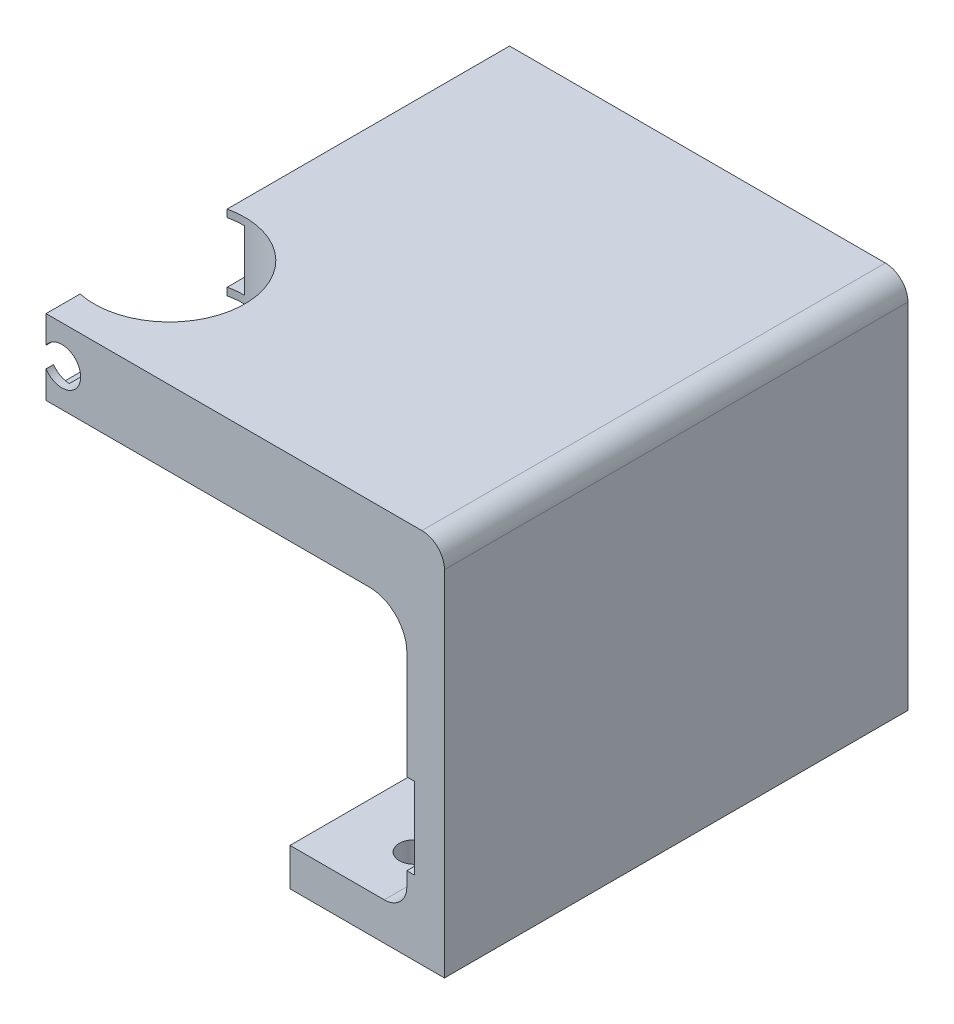
ISO-10303-21;
HEADER;
FILE_DESCRIPTION(('STEP AP214'),'2;1');
FILE_NAME('part.step','',(''),(''),'','','');
FILE_SCHEMA(('AUTOMOTIVE_DESIGN { 1 0 10303 214 1 1 1 1 }'));
ENDSEC;
DATA;
#1=APPLICATION_CONTEXT('core data for automotive mechanical design processes');
#2=APPLICATION_PROTOCOL_DEFINITION('international standard','automotive_design',2000,#1);
#3=PRODUCT_CONTEXT('',#1,'mechanical');
#4=PRODUCT('Part','Part','',(#3));
#5=PRODUCT_RELATED_PRODUCT_CATEGORY('part','',(#4));
#6=PRODUCT_DEFINITION_FORMATION('','',#4);
#7=PRODUCT_DEFINITION_CONTEXT('part definition',#1,'design');
#8=PRODUCT_DEFINITION('design','',#6,#7);
#9=PRODUCT_DEFINITION_SHAPE('','',#8);
#10=(LENGTH_UNIT() NAMED_UNIT(*) SI_UNIT(.MILLI.,.METRE.));
#11=(NAMED_UNIT(*) PLANE_ANGLE_UNIT() SI_UNIT($,.RADIAN.));
#12=(NAMED_UNIT(*) SI_UNIT($,.STERADIAN.) SOLID_ANGLE_UNIT());
#13=UNCERTAINTY_MEASURE_WITH_UNIT(LENGTH_MEASURE(1.E-05),#10,'distance_accuracy_value','');
#14=(GEOMETRIC_REPRESENTATION_CONTEXT(3) GLOBAL_UNCERTAINTY_ASSIGNED_CONTEXT((#13)) GLOBAL_UNIT_ASSIGNED_CONTEXT((#10,
#11,#12)) REPRESENTATION_CONTEXT('',''));
#15=CARTESIAN_POINT('',(0.,0.,0.));
#16=DIRECTION('',(0.,0.,1.));
#17=DIRECTION('',(1.,0.,0.));
#18=AXIS2_PLACEMENT_3D('',#15,#16,#17);
#19=CARTESIAN_POINT('',(-2.1,0.,0.));
#20=DIRECTION('',(-1.,0.,0.));
#21=DIRECTION('',(0.,0.,1.));
#22=AXIS2_PLACEMENT_3D('',#19,#20,#21);
#23=PLANE('',#22);
#24=DIRECTION('',(0.,1.,0.));
#25=VECTOR('',#24,1.);
#26=CARTESIAN_POINT('',(-2.1,-4.00000000000001,9.77701385904715));
#27=LINE('',#26,#25);
#28=CARTESIAN_POINT('',(-2.1,9.,9.77701385904715));
#29=VERTEX_POINT('',#28);
#30=CARTESIAN_POINT('',(-2.1,10.,9.77701385904715));
#31=VERTEX_POINT('',#30);
#32=EDGE_CURVE('E229',#29,#31,#27,.T.);
#33=ORIENTED_EDGE('',*,*,#32,.F.);
#34=DIRECTION('',(0.,0.,-1.));
#35=VECTOR('',#34,1.);
#36=CARTESIAN_POINT('',(-2.1,9.,-46.3));
#37=LINE('',#36,#35);
#38=CARTESIAN_POINT('',(-2.1,9.,13.3));
#39=VERTEX_POINT('',#38);
#40=EDGE_CURVE('E449',#39,#29,#37,.T.);
#41=ORIENTED_EDGE('',*,*,#40,.F.);
#42=DIRECTION('',(0.,1.,0.));
#43=VECTOR('',#42,1.);
#44=CARTESIAN_POINT('',(-2.1,9.,13.3));
#45=LINE('',#44,#43);
#46=CARTESIAN_POINT('',(-2.1,6.35646599662506,13.3));
#47=VERTEX_POINT('',#46);
#48=EDGE_CURVE('E470',#47,#39,#45,.T.);
#49=ORIENTED_EDGE('',*,*,#48,.F.);
#50=DIRECTION('',(0.,0.,1.));
#51=VECTOR('',#50,1.);
#52=CARTESIAN_POINT('',(-2.1,6.35646599662506,12.3));
#53=LINE('',#52,#51);
#54=CARTESIAN_POINT('',(-2.1,6.35646599662506,14.3));
#55=VERTEX_POINT('',#54);
#56=EDGE_CURVE('E464',#55,#47,#53,.F.);
#57=ORIENTED_EDGE('',*,*,#56,.F.);
#58=DIRECTION('',(0.,1.,0.));
#59=VECTOR('',#58,1.);
#60=CARTESIAN_POINT('',(-2.1,10.,14.3));
#61=LINE('',#60,#59);
#62=CARTESIAN_POINT('',(-2.1,10.,14.3));
#63=VERTEX_POINT('',#62);
#64=EDGE_CURVE('E258',#55,#63,#61,.T.);
#65=ORIENTED_EDGE('',*,*,#64,.T.);
#66=DIRECTION('',(0.,0.,-1.));
#67=VECTOR('',#66,1.);
#68=CARTESIAN_POINT('',(-2.1,10.,-47.3));
#69=LINE('',#68,#67);
#70=EDGE_CURVE('E253',#63,#31,#69,.T.);
#71=ORIENTED_EDGE('',*,*,#70,.T.);
#72=EDGE_LOOP('',(#33,#41,#49,#57,#65,#71));
#73=FACE_BOUND('',#72,.T.);
#74=ADVANCED_FACE('F39',(#73),#23,.T.);
#75=CARTESIAN_POINT('',(-2.1,0.,9.77701385904715));
#76=VERTEX_POINT('',#75);
#77=CARTESIAN_POINT('',(-2.1,0.999999999999999,9.77701385904715));
#78=VERTEX_POINT('',#77);
#79=EDGE_CURVE('E61',#76,#78,#27,.T.);
#80=ORIENTED_EDGE('',*,*,#79,.F.);
#81=DIRECTION('',(0.,0.,1.));
#82=VECTOR('',#81,1.);
#83=CARTESIAN_POINT('',(-2.1,0.,-47.3));
#84=LINE('',#83,#82);
#85=CARTESIAN_POINT('',(-2.1,0.,14.3));
#86=VERTEX_POINT('',#85);
#87=EDGE_CURVE('E496',#76,#86,#84,.T.);
#88=ORIENTED_EDGE('',*,*,#87,.T.);
#89=CARTESIAN_POINT('',(-2.1,3.64353400337494,14.3));
#90=VERTEX_POINT('',#89);
#91=EDGE_CURVE('E254',#86,#90,#61,.T.);
#92=ORIENTED_EDGE('',*,*,#91,.T.);
#93=DIRECTION('',(0.,0.,1.));
#94=VECTOR('',#93,1.);
#95=CARTESIAN_POINT('',(-2.1,3.64353400337494,12.3));
#96=LINE('',#95,#94);
#97=CARTESIAN_POINT('',(-2.1,3.64353400337494,13.3));
#98=VERTEX_POINT('',#97);
#99=EDGE_CURVE('E450',#98,#90,#96,.T.);
#100=ORIENTED_EDGE('',*,*,#99,.F.);
#101=CARTESIAN_POINT('',(-2.1,0.999999999999999,13.3));
#102=VERTEX_POINT('',#101);
#103=EDGE_CURVE('E471',#102,#98,#45,.T.);
#104=ORIENTED_EDGE('',*,*,#103,.F.);
#105=DIRECTION('',(0.,0.,1.));
#106=VECTOR('',#105,1.);
#107=CARTESIAN_POINT('',(-2.1,1.,-46.3));
#108=LINE('',#107,#106);
#109=EDGE_CURVE('E460',#78,#102,#108,.T.);
#110=ORIENTED_EDGE('',*,*,#109,.F.);
#111=EDGE_LOOP('',(#80,#88,#92,#100,#104,#110));
#112=FACE_BOUND('',#111,.T.);
#113=ADVANCED_FACE('F416',(#112),#23,.T.);
#114=CARTESIAN_POINT('',(-2.1,9.,-46.3));
#115=DIRECTION('',(0.,-1.,0.));
#116=DIRECTION('',(0.,0.,-1.));
#117=AXIS2_PLACEMENT_3D('',#114,#115,#116);
#118=PLANE('',#117);
#119=CARTESIAN_POINT('',(0.,9.,0.));
#120=DIRECTION('',(0.,-1.,0.));
#121=DIRECTION('',(0.,0.,-1.));
#122=AXIS2_PLACEMENT_3D('',#119,#120,#121);
#123=CIRCLE('',#122,10.);
#124=CARTESIAN_POINT('',(0.,9.,10.));
#125=VERTEX_POINT('',#124);
#126=EDGE_CURVE('E451',#125,#29,#123,.T.);
#127=ORIENTED_EDGE('',*,*,#126,.F.);
#128=DIRECTION('',(0.,0.,-1.));
#129=VECTOR('',#128,1.);
#130=CARTESIAN_POINT('',(0.,9.,-46.3));
#131=LINE('',#130,#129);
#132=CARTESIAN_POINT('',(0.,9.,13.3));
#133=VERTEX_POINT('',#132);
#134=EDGE_CURVE('E474',#133,#125,#131,.T.);
#135=ORIENTED_EDGE('',*,*,#134,.F.);
#136=DIRECTION('',(1.,0.,0.));
#137=VECTOR('',#136,1.);
#138=CARTESIAN_POINT('',(-2.1,9.,13.3));
#139=LINE('',#138,#137);
#140=EDGE_CURVE('E457',#39,#133,#139,.T.);
#141=ORIENTED_EDGE('',*,*,#140,.F.);
#142=ORIENTED_EDGE('',*,*,#40,.T.);
#143=EDGE_LOOP('',(#127,#135,#141,#142));
#144=FACE_BOUND('',#143,.T.);
#145=ADVANCED_FACE('F421',(#144),#118,.T.);
#146=CARTESIAN_POINT('',(-2.1,1.,-46.3));
#147=DIRECTION('',(0.,1.,0.));
#148=DIRECTION('',(0.,0.,1.));
#149=AXIS2_PLACEMENT_3D('',#146,#147,#148);
#150=PLANE('',#149);
#151=CARTESIAN_POINT('',(0.,0.999999999999999,0.));
#152=DIRECTION('',(0.,1.,0.));
#153=DIRECTION('',(0.,0.,1.));
#154=AXIS2_PLACEMENT_3D('',#151,#152,#153);
#155=CIRCLE('',#154,10.);
#156=CARTESIAN_POINT('',(0.,1.,-10.));
#157=VERTEX_POINT('',#156);
#158=CARTESIAN_POINT('',(-2.1,0.999999999999999,-9.77701385904715));
#159=VERTEX_POINT('',#158);
#160=EDGE_CURVE('E11',#157,#159,#155,.T.);
#161=ORIENTED_EDGE('',*,*,#160,.F.);
#162=DIRECTION('',(0.,0.,1.));
#163=VECTOR('',#162,1.);
#164=CARTESIAN_POINT('',(0.,1.,-46.3));
#165=LINE('',#164,#163);
#166=CARTESIAN_POINT('',(0.,1.,-46.3));
#167=VERTEX_POINT('',#166);
#168=EDGE_CURVE('E481',#167,#157,#165,.T.);
#169=ORIENTED_EDGE('',*,*,#168,.F.);
#170=DIRECTION('',(1.,0.,0.));
#171=VECTOR('',#170,1.);
#172=CARTESIAN_POINT('',(-2.1,1.,-46.3));
#173=LINE('',#172,#171);
#174=CARTESIAN_POINT('',(-2.1,1.,-46.3));
#175=VERTEX_POINT('',#174);
#176=EDGE_CURVE('E490',#175,#167,#173,.T.);
#177=ORIENTED_EDGE('',*,*,#176,.F.);
#178=EDGE_CURVE('E467',#175,#159,#108,.T.);
#179=ORIENTED_EDGE('',*,*,#178,.T.);
#180=EDGE_LOOP('',(#161,#169,#177,#179));
#181=FACE_BOUND('',#180,.T.);
#182=ADVANCED_FACE('F430',(#181),#150,.T.);
#183=CARTESIAN_POINT('',(-2.1,9.,13.3));
#184=DIRECTION('',(0.,0.,-1.));
#185=DIRECTION('',(-1.,0.,0.));
#186=AXIS2_PLACEMENT_3D('',#183,#184,#185);
#187=PLANE('',#186);
#188=CARTESIAN_POINT('',(0.,5.,13.3));
#189=DIRECTION('',(0.,0.,-1.));
#190=DIRECTION('',(-1.,0.,0.));
#191=AXIS2_PLACEMENT_3D('',#188,#189,#190);
#192=CIRCLE('',#191,2.5);
#193=CARTESIAN_POINT('',(0.,7.5,13.3));
#194=VERTEX_POINT('',#193);
#195=EDGE_CURVE('E563',#47,#194,#192,.T.);
#196=ORIENTED_EDGE('',*,*,#195,.F.);
#197=ORIENTED_EDGE('',*,*,#48,.T.);
#198=ORIENTED_EDGE('',*,*,#140,.T.);
#199=DIRECTION('',(0.,1.,0.));
#200=VECTOR('',#199,1.);
#201=CARTESIAN_POINT('',(0.,9.,13.3));
#202=LINE('',#201,#200);
#203=EDGE_CURVE('E484',#194,#133,#202,.T.);
#204=ORIENTED_EDGE('',*,*,#203,.F.);
#205=EDGE_LOOP('',(#196,#197,#198,#204));
#206=FACE_BOUND('',#205,.T.);
#207=ADVANCED_FACE('F433',(#206),#187,.T.);
#208=CARTESIAN_POINT('',(0.,0.,0.));
#209=DIRECTION('',(1.,0.,0.));
#210=DIRECTION('',(0.,0.,-1.));
#211=AXIS2_PLACEMENT_3D('',#208,#209,#210);
#212=PLANE('',#211);
#213=DIRECTION('',(0.,1.,0.));
#214=VECTOR('',#213,1.);
#215=CARTESIAN_POINT('',(0.,0.,-10.));
#216=LINE('',#215,#214);
#217=CARTESIAN_POINT('',(0.,9.,-10.));
#218=VERTEX_POINT('',#217);
#219=EDGE_CURVE('E532',#218,#157,#216,.F.);
#220=ORIENTED_EDGE('',*,*,#219,.F.);
#221=CARTESIAN_POINT('',(0.,9.,-46.3));
#222=VERTEX_POINT('',#221);
#223=EDGE_CURVE('E477',#218,#222,#131,.T.);
#224=ORIENTED_EDGE('',*,*,#223,.T.);
#225=DIRECTION('',(0.,-1.,0.));
#226=VECTOR('',#225,1.);
#227=CARTESIAN_POINT('',(0.,9.,-46.3));
#228=LINE('',#227,#226);
#229=EDGE_CURVE('E476',#222,#167,#228,.T.);
#230=ORIENTED_EDGE('',*,*,#229,.T.);
#231=ORIENTED_EDGE('',*,*,#168,.T.);
#232=EDGE_LOOP('',(#220,#224,#230,#231));
#233=FACE_BOUND('',#232,.T.);
#234=ADVANCED_FACE('F439',(#233),#212,.F.);
#235=ORIENTED_EDGE('',*,*,#203,.T.);
#236=ORIENTED_EDGE('',*,*,#134,.T.);
#237=DIRECTION('',(0.,1.,0.));
#238=VECTOR('',#237,1.);
#239=CARTESIAN_POINT('',(0.,0.,10.));
#240=LINE('',#239,#238);
#241=CARTESIAN_POINT('',(0.,7.5,10.));
#242=VERTEX_POINT('',#241);
#243=EDGE_CURVE('E538',#242,#125,#240,.T.);
#244=ORIENTED_EDGE('',*,*,#243,.F.);
#245=DIRECTION('',(0.,0.,1.));
#246=VECTOR('',#245,1.);
#247=CARTESIAN_POINT('',(0.,7.5,4.3));
#248=LINE('',#247,#246);
#249=EDGE_CURVE('E575',#194,#242,#248,.F.);
#250=ORIENTED_EDGE('',*,*,#249,.F.);
#251=EDGE_LOOP('',(#235,#236,#244,#250));
#252=FACE_BOUND('',#251,.T.);
#253=ADVANCED_FACE('F757',(#252),#212,.F.);
#254=CARTESIAN_POINT('',(0.,0.999999999999999,10.));
#255=VERTEX_POINT('',#254);
#256=CARTESIAN_POINT('',(0.,2.5,10.));
#257=VERTEX_POINT('',#256);
#258=EDGE_CURVE('E534',#255,#257,#240,.T.);
#259=ORIENTED_EDGE('',*,*,#258,.F.);
#260=CARTESIAN_POINT('',(0.,0.999999999999999,13.3));
#261=VERTEX_POINT('',#260);
#262=EDGE_CURVE('E480',#255,#261,#165,.T.);
#263=ORIENTED_EDGE('',*,*,#262,.T.);
#264=CARTESIAN_POINT('',(0.,2.5,13.3));
#265=VERTEX_POINT('',#264);
#266=EDGE_CURVE('E462',#261,#265,#202,.T.);
#267=ORIENTED_EDGE('',*,*,#266,.T.);
#268=DIRECTION('',(0.,0.,1.));
#269=VECTOR('',#268,1.);
#270=CARTESIAN_POINT('',(0.,2.5,4.3));
#271=LINE('',#270,#269);
#272=EDGE_CURVE('E573',#257,#265,#271,.T.);
#273=ORIENTED_EDGE('',*,*,#272,.F.);
#274=EDGE_LOOP('',(#259,#263,#267,#273));
#275=FACE_BOUND('',#274,.T.);
#276=ADVANCED_FACE('F358',(#275),#212,.F.);
#277=CARTESIAN_POINT('',(48.85,-24.75,-31.9));
#278=DIRECTION('',(-1.,0.,0.));
#279=DIRECTION('',(0.,0.,1.));
#280=AXIS2_PLACEMENT_3D('',#277,#278,#279);
#281=PLANE('',#280);
#282=CARTESIAN_POINT('',(48.85,-24.75,-31.9));
#283=DIRECTION('',(1.,0.,0.));
#284=DIRECTION('',(0.,0.,1.));
#285=AXIS2_PLACEMENT_3D('',#282,#283,#284);
#286=CIRCLE('',#285,4.10389214822363);
#287=CARTESIAN_POINT('',(48.85,-24.75,-27.7961078517764));
#288=VERTEX_POINT('',#287);
#289=EDGE_CURVE('E256',#288,#288,#286,.T.);
#290=ORIENTED_EDGE('',*,*,#289,.F.);
#291=EDGE_LOOP('',(#290));
#292=FACE_BOUND('',#291,.T.);
#293=ADVANCED_FACE('F398',(#292),#281,.T.);
#294=CARTESIAN_POINT('',(48.85,-24.75,-1.1));
#295=DIRECTION('',(1.,0.,0.));
#296=DIRECTION('',(0.,0.,-1.));
#297=AXIS2_PLACEMENT_3D('',#294,#295,#296);
#298=PLANE('',#297);
#299=CARTESIAN_POINT('',(48.85,-24.75,-1.1));
#300=DIRECTION('',(1.,0.,0.));
#301=DIRECTION('',(0.,0.,-1.));
#302=AXIS2_PLACEMENT_3D('',#299,#300,#301);
#303=CIRCLE('',#302,4.10389214822363);
#304=CARTESIAN_POINT('',(48.85,-24.75,-5.20389214822363));
#305=VERTEX_POINT('',#304);
#306=EDGE_CURVE('E262',#305,#305,#303,.T.);
#307=ORIENTED_EDGE('',*,*,#306,.F.);
#308=EDGE_LOOP('',(#307));
#309=FACE_BOUND('',#308,.T.);
#310=ADVANCED_FACE('F401',(#309),#298,.F.);
#311=CARTESIAN_POINT('',(48.85,-24.75,-31.9));
#312=DIRECTION('',(-1.,0.,0.));
#313=DIRECTION('',(0.,0.,1.));
#314=AXIS2_PLACEMENT_3D('',#311,#312,#313);
#315=CYLINDRICAL_SURFACE('',#314,4.10389214822363);
#316=ORIENTED_EDGE('',*,*,#289,.T.);
#317=EDGE_LOOP('',(#316));
#318=FACE_BOUND('',#317,.T.);
#319=CARTESIAN_POINT('',(46.85,-24.75,-31.9));
#320=DIRECTION('',(1.,0.,0.));
#321=DIRECTION('',(0.,0.,-1.));
#322=AXIS2_PLACEMENT_3D('',#319,#320,#321);
#323=CIRCLE('',#322,4.10389214822363);
#324=CARTESIAN_POINT('',(46.85,-24.75,-36.0038921482236));
#325=VERTEX_POINT('',#324);
#326=EDGE_CURVE('E265',#325,#325,#323,.F.);
#327=ORIENTED_EDGE('',*,*,#326,.T.);
#328=EDGE_LOOP('',(#327));
#329=FACE_BOUND('',#328,.T.);
#330=ADVANCED_FACE('F403',(#318,#329),#315,.F.);
#331=CARTESIAN_POINT('',(48.85,-24.75,-1.1));
#332=DIRECTION('',(-1.,0.,0.));
#333=DIRECTION('',(0.,0.,1.));
#334=AXIS2_PLACEMENT_3D('',#331,#332,#333);
#335=CYLINDRICAL_SURFACE('',#334,4.10389214822363);
#336=ORIENTED_EDGE('',*,*,#306,.T.);
#337=EDGE_LOOP('',(#336));
#338=FACE_BOUND('',#337,.T.);
#339=CARTESIAN_POINT('',(46.85,-24.75,-1.1));
#340=DIRECTION('',(1.,0.,0.));
#341=DIRECTION('',(0.,0.,-1.));
#342=AXIS2_PLACEMENT_3D('',#339,#340,#341);
#343=CIRCLE('',#342,4.10389214822363);
#344=CARTESIAN_POINT('',(46.85,-24.75,-5.20389214822363));
#345=VERTEX_POINT('',#344);
#346=EDGE_CURVE('E279',#345,#345,#343,.F.);
#347=ORIENTED_EDGE('',*,*,#346,.T.);
#348=EDGE_LOOP('',(#347));
#349=FACE_BOUND('',#348,.T.);
#350=ADVANCED_FACE('F385',(#338,#349),#335,.F.);
#351=CARTESIAN_POINT('',(39.35,-30.,6.80000000000002));
#352=DIRECTION('',(0.,-1.,0.));
#353=DIRECTION('',(0.,0.,-1.));
#354=AXIS2_PLACEMENT_3D('',#351,#352,#353);
#355=CYLINDRICAL_SURFACE('',#354,2.);
#356=CARTESIAN_POINT('',(39.35,-40.,6.80000000000002));
#357=DIRECTION('',(0.,-1.,0.));
#358=DIRECTION('',(0.,0.,1.));
#359=AXIS2_PLACEMENT_3D('',#356,#357,#358);
#360=CIRCLE('',#359,2.);
#361=CARTESIAN_POINT('',(39.35,-40.,8.80000000000002));
#362=VERTEX_POINT('',#361);
#363=EDGE_CURVE('E287',#362,#362,#360,.T.);
#364=ORIENTED_EDGE('',*,*,#363,.T.);
#365=EDGE_LOOP('',(#364));
#366=FACE_BOUND('',#365,.T.);
#367=CARTESIAN_POINT('',(39.35,-35.,6.80000000000002));
#368=DIRECTION('',(0.,-1.,0.));
#369=DIRECTION('',(0.,0.,-1.));
#370=AXIS2_PLACEMENT_3D('',#367,#368,#369);
#371=CIRCLE('',#370,2.);
#372=CARTESIAN_POINT('',(39.35,-35.,4.80000000000001));
#373=VERTEX_POINT('',#372);
#374=EDGE_CURVE('E290',#373,#373,#371,.T.);
#375=ORIENTED_EDGE('',*,*,#374,.F.);
#376=EDGE_LOOP('',(#375));
#377=FACE_BOUND('',#376,.T.);
#378=ADVANCED_FACE('F381',(#366,#377),#355,.F.);
#379=CARTESIAN_POINT('',(46.85,-19.35,-85.7));
#380=DIRECTION('',(0.,1.,0.));
#381=DIRECTION('',(0.,0.,1.));
#382=AXIS2_PLACEMENT_3D('',#379,#380,#381);
#383=PLANE('',#382);
#384=DIRECTION('',(0.,0.,1.));
#385=VECTOR('',#384,1.);
#386=CARTESIAN_POINT('',(46.85,-19.35,-85.7));
#387=LINE('',#386,#385);
#388=CARTESIAN_POINT('',(46.85,-19.35,-47.3));
#389=VERTEX_POINT('',#388);
#390=CARTESIAN_POINT('',(46.85,-19.35,14.3));
#391=VERTEX_POINT('',#390);
#392=EDGE_CURVE('E268',#389,#391,#387,.T.);
#393=ORIENTED_EDGE('',*,*,#392,.T.);
#394=DIRECTION('',(-1.,0.,0.));
#395=VECTOR('',#394,1.);
#396=CARTESIAN_POINT('',(46.85,-19.35,14.3));
#397=LINE('',#396,#395);
#398=CARTESIAN_POINT('',(45.85,-19.35,14.3));
#399=VERTEX_POINT('',#398);
#400=EDGE_CURVE('E282',#391,#399,#397,.T.);
#401=ORIENTED_EDGE('',*,*,#400,.T.);
#402=DIRECTION('',(0.,0.,1.));
#403=VECTOR('',#402,1.);
#404=CARTESIAN_POINT('',(45.85,-19.35,-85.7));
#405=LINE('',#404,#403);
#406=CARTESIAN_POINT('',(45.85,-19.35,-47.3));
#407=VERTEX_POINT('',#406);
#408=EDGE_CURVE('E271',#407,#399,#405,.T.);
#409=ORIENTED_EDGE('',*,*,#408,.F.);
#410=DIRECTION('',(-1.,0.,0.));
#411=VECTOR('',#410,1.);
#412=CARTESIAN_POINT('',(-45.85,-19.35,-47.3));
#413=LINE('',#412,#411);
#414=EDGE_CURVE('E337',#389,#407,#413,.T.);
#415=ORIENTED_EDGE('',*,*,#414,.F.);
#416=EDGE_LOOP('',(#393,#401,#409,#415));
#417=FACE_BOUND('',#416,.T.);
#418=ADVANCED_FACE('F384',(#417),#383,.F.);
#419=CARTESIAN_POINT('',(46.85,-30.15,-85.7));
#420=DIRECTION('',(1.,0.,0.));
#421=DIRECTION('',(0.,0.,-1.));
#422=AXIS2_PLACEMENT_3D('',#419,#420,#421);
#423=PLANE('',#422);
#424=ORIENTED_EDGE('',*,*,#346,.F.);
#425=EDGE_LOOP('',(#424));
#426=FACE_BOUND('',#425,.T.);
#427=ORIENTED_EDGE('',*,*,#326,.F.);
#428=EDGE_LOOP('',(#427));
#429=FACE_BOUND('',#428,.T.);
#430=DIRECTION('',(0.,0.,1.));
#431=VECTOR('',#430,1.);
#432=CARTESIAN_POINT('',(46.85,-30.15,-85.7));
#433=LINE('',#432,#431);
#434=CARTESIAN_POINT('',(46.85,-30.15,-47.3));
#435=VERTEX_POINT('',#434);
#436=CARTESIAN_POINT('',(46.85,-30.15,14.3));
#437=VERTEX_POINT('',#436);
#438=EDGE_CURVE('E277',#435,#437,#433,.T.);
#439=ORIENTED_EDGE('',*,*,#438,.T.);
#440=DIRECTION('',(0.,1.,0.));
#441=VECTOR('',#440,1.);
#442=CARTESIAN_POINT('',(46.85,-30.15,14.3));
#443=LINE('',#442,#441);
#444=EDGE_CURVE('E284',#437,#391,#443,.T.);
#445=ORIENTED_EDGE('',*,*,#444,.T.);
#446=ORIENTED_EDGE('',*,*,#392,.F.);
#447=DIRECTION('',(0.,1.,0.));
#448=VECTOR('',#447,1.);
#449=CARTESIAN_POINT('',(46.85,10.,-47.3));
#450=LINE('',#449,#448);
#451=EDGE_CURVE('E588',#435,#389,#450,.T.);
#452=ORIENTED_EDGE('',*,*,#451,.F.);
#453=EDGE_LOOP('',(#439,#445,#446,#452));
#454=FACE_BOUND('',#453,.T.);
#455=ADVANCED_FACE('F390',(#426,#429,#454),#423,.F.);
#456=CARTESIAN_POINT('',(45.85,-30.15,-85.7));
#457=DIRECTION('',(0.,-1.,0.));
#458=DIRECTION('',(0.,0.,-1.));
#459=AXIS2_PLACEMENT_3D('',#456,#457,#458);
#460=PLANE('',#459);
#461=DIRECTION('',(0.,0.,1.));
#462=VECTOR('',#461,1.);
#463=CARTESIAN_POINT('',(45.85,-30.15,-85.7));
#464=LINE('',#463,#462);
#465=CARTESIAN_POINT('',(45.85,-30.15,-47.3));
#466=VERTEX_POINT('',#465);
#467=CARTESIAN_POINT('',(45.85,-30.15,14.3));
#468=VERTEX_POINT('',#467);
#469=EDGE_CURVE('E274',#466,#468,#464,.T.);
#470=ORIENTED_EDGE('',*,*,#469,.T.);
#471=DIRECTION('',(1.,0.,0.));
#472=VECTOR('',#471,1.);
#473=CARTESIAN_POINT('',(45.85,-30.15,14.3));
#474=LINE('',#473,#472);
#475=EDGE_CURVE('E270',#468,#437,#474,.T.);
#476=ORIENTED_EDGE('',*,*,#475,.T.);
#477=ORIENTED_EDGE('',*,*,#438,.F.);
#478=DIRECTION('',(1.,0.,0.));
#479=VECTOR('',#478,1.);
#480=CARTESIAN_POINT('',(-45.85,-30.15,-47.3));
#481=LINE('',#480,#479);
#482=EDGE_CURVE('E576',#466,#435,#481,.T.);
#483=ORIENTED_EDGE('',*,*,#482,.F.);
#484=EDGE_LOOP('',(#470,#476,#477,#483));
#485=FACE_BOUND('',#484,.T.);
#486=ADVANCED_FACE('F387',(#485),#460,.F.);
#487=CARTESIAN_POINT('',(45.85,-40.,-47.3));
#488=DIRECTION('',(-1.,0.,0.));
#489=DIRECTION('',(0.,0.,1.));
#490=AXIS2_PLACEMENT_3D('',#487,#488,#489);
#491=PLANE('',#490);
#492=DIRECTION('',(0.,1.,0.));
#493=VECTOR('',#492,1.);
#494=CARTESIAN_POINT('',(45.85,-40.,-47.3));
#495=LINE('',#494,#493);
#496=CARTESIAN_POINT('',(45.85,-32.,-47.3));
#497=VERTEX_POINT('',#496);
#498=EDGE_CURVE('E319',#497,#466,#495,.T.);
#499=ORIENTED_EDGE('',*,*,#498,.F.);
#500=DIRECTION('',(0.,0.,1.));
#501=VECTOR('',#500,1.);
#502=CARTESIAN_POINT('',(45.85,-32.,-47.3));
#503=LINE('',#502,#501);
#504=CARTESIAN_POINT('',(45.85,-32.,14.3));
#505=VERTEX_POINT('',#504);
#506=EDGE_CURVE('E555',#497,#505,#503,.T.);
#507=ORIENTED_EDGE('',*,*,#506,.T.);
#508=DIRECTION('',(0.,1.,0.));
#509=VECTOR('',#508,1.);
#510=CARTESIAN_POINT('',(45.85,-40.,14.3));
#511=LINE('',#510,#509);
#512=EDGE_CURVE('E309',#505,#468,#511,.T.);
#513=ORIENTED_EDGE('',*,*,#512,.T.);
#514=ORIENTED_EDGE('',*,*,#469,.F.);
#515=EDGE_LOOP('',(#499,#507,#513,#514));
#516=FACE_BOUND('',#515,.T.);
#517=ADVANCED_FACE('F373',(#516),#491,.T.);
#518=CARTESIAN_POINT('',(0.,-35.,0.));
#519=DIRECTION('',(0.,-1.,0.));
#520=DIRECTION('',(0.,0.,-1.));
#521=AXIS2_PLACEMENT_3D('',#518,#519,#520);
#522=PLANE('',#521);
#523=ORIENTED_EDGE('',*,*,#374,.T.);
#524=EDGE_LOOP('',(#523));
#525=FACE_BOUND('',#524,.T.);
#526=DIRECTION('',(-1.,0.,0.));
#527=VECTOR('',#526,1.);
#528=CARTESIAN_POINT('',(45.85,-35.,14.3));
#529=LINE('',#528,#527);
#530=CARTESIAN_POINT('',(42.85,-35.,14.3));
#531=VERTEX_POINT('',#530);
#532=CARTESIAN_POINT('',(30.3206729057567,-35.,14.3));
#533=VERTEX_POINT('',#532);
#534=EDGE_CURVE('E294',#531,#533,#529,.T.);
#535=ORIENTED_EDGE('',*,*,#534,.F.);
#536=DIRECTION('',(0.,0.,1.));
#537=VECTOR('',#536,1.);
#538=CARTESIAN_POINT('',(42.85,-35.,0.));
#539=LINE('',#538,#537);
#540=CARTESIAN_POINT('',(42.85,-35.,-47.3));
#541=VERTEX_POINT('',#540);
#542=EDGE_CURVE('E558',#531,#541,#539,.F.);
#543=ORIENTED_EDGE('',*,*,#542,.T.);
#544=DIRECTION('',(1.,0.,0.));
#545=VECTOR('',#544,1.);
#546=CARTESIAN_POINT('',(30.3206729057567,-35.,-47.3));
#547=LINE('',#546,#545);
#548=CARTESIAN_POINT('',(30.3206729057567,-35.,-47.3));
#549=VERTEX_POINT('',#548);
#550=EDGE_CURVE('E304',#549,#541,#547,.T.);
#551=ORIENTED_EDGE('',*,*,#550,.F.);
#552=DIRECTION('',(0.,0.,-1.));
#553=VECTOR('',#552,1.);
#554=CARTESIAN_POINT('',(30.3206729057567,-35.,14.3));
#555=LINE('',#554,#553);
#556=EDGE_CURVE('E302',#533,#549,#555,.T.);
#557=ORIENTED_EDGE('',*,*,#556,.F.);
#558=EDGE_LOOP('',(#535,#543,#551,#557));
#559=FACE_BOUND('',#558,.T.);
#560=ADVANCED_FACE('F374',(#525,#559),#522,.F.);
#561=CARTESIAN_POINT('',(30.3206729057567,-35.,14.3));
#562=DIRECTION('',(-1.,0.,0.));
#563=DIRECTION('',(0.,0.,1.));
#564=AXIS2_PLACEMENT_3D('',#561,#562,#563);
#565=PLANE('',#564);
#566=DIRECTION('',(0.,0.,-1.));
#567=VECTOR('',#566,1.);
#568=CARTESIAN_POINT('',(30.3206729057567,-40.,14.3));
#569=LINE('',#568,#567);
#570=CARTESIAN_POINT('',(30.3206729057567,-40.,14.3));
#571=VERTEX_POINT('',#570);
#572=CARTESIAN_POINT('',(30.3206729057567,-40.,-47.3));
#573=VERTEX_POINT('',#572);
#574=EDGE_CURVE('E298',#571,#573,#569,.T.);
#575=ORIENTED_EDGE('',*,*,#574,.F.);
#576=DIRECTION('',(0.,-1.,0.));
#577=VECTOR('',#576,1.);
#578=CARTESIAN_POINT('',(30.3206729057567,-35.,14.3));
#579=LINE('',#578,#577);
#580=EDGE_CURVE('E295',#533,#571,#579,.T.);
#581=ORIENTED_EDGE('',*,*,#580,.F.);
#582=ORIENTED_EDGE('',*,*,#556,.T.);
#583=DIRECTION('',(0.,-1.,0.));
#584=VECTOR('',#583,1.);
#585=CARTESIAN_POINT('',(30.3206729057567,-35.,-47.3));
#586=LINE('',#585,#584);
#587=EDGE_CURVE('E291',#549,#573,#586,.T.);
#588=ORIENTED_EDGE('',*,*,#587,.T.);
#589=EDGE_LOOP('',(#575,#581,#582,#588));
#590=FACE_BOUND('',#589,.T.);
#591=ADVANCED_FACE('F363',(#590),#565,.T.);
#592=CARTESIAN_POINT('',(0.,-40.,0.));
#593=DIRECTION('',(0.,1.,0.));
#594=DIRECTION('',(0.,0.,1.));
#595=AXIS2_PLACEMENT_3D('',#592,#593,#594);
#596=PLANE('',#595);
#597=ORIENTED_EDGE('',*,*,#363,.F.);
#598=EDGE_LOOP('',(#597));
#599=FACE_BOUND('',#598,.T.);
#600=DIRECTION('',(1.,0.,0.));
#601=VECTOR('',#600,1.);
#602=CARTESIAN_POINT('',(45.85,-40.,14.3));
#603=LINE('',#602,#601);
#604=CARTESIAN_POINT('',(50.85,-40.,14.3));
#605=VERTEX_POINT('',#604);
#606=EDGE_CURVE('E325',#571,#605,#603,.T.);
#607=ORIENTED_EDGE('',*,*,#606,.F.);
#608=ORIENTED_EDGE('',*,*,#574,.T.);
#609=DIRECTION('',(-1.,0.,0.));
#610=VECTOR('',#609,1.);
#611=CARTESIAN_POINT('',(45.85,-40.,-47.3));
#612=LINE('',#611,#610);
#613=CARTESIAN_POINT('',(50.85,-40.,-47.3));
#614=VERTEX_POINT('',#613);
#615=EDGE_CURVE('E311',#614,#573,#612,.T.);
#616=ORIENTED_EDGE('',*,*,#615,.F.);
#617=DIRECTION('',(0.,0.,-1.));
#618=VECTOR('',#617,1.);
#619=CARTESIAN_POINT('',(50.85,-40.,14.3));
#620=LINE('',#619,#618);
#621=EDGE_CURVE('E322',#605,#614,#620,.T.);
#622=ORIENTED_EDGE('',*,*,#621,.F.);
#623=EDGE_LOOP('',(#607,#608,#616,#622));
#624=FACE_BOUND('',#623,.T.);
#625=ADVANCED_FACE('F359',(#599,#624),#596,.F.);
#626=CARTESIAN_POINT('',(50.85,-40.,14.3));
#627=DIRECTION('',(1.,0.,0.));
#628=DIRECTION('',(0.,0.,-1.));
#629=AXIS2_PLACEMENT_3D('',#626,#627,#628);
#630=PLANE('',#629);
#631=DIRECTION('',(0.,1.,0.));
#632=VECTOR('',#631,1.);
#633=CARTESIAN_POINT('',(50.85,-40.,-47.3));
#634=LINE('',#633,#632);
#635=CARTESIAN_POINT('',(50.85,7.,-47.3));
#636=VERTEX_POINT('',#635);
#637=EDGE_CURVE('E316',#614,#636,#634,.T.);
#638=ORIENTED_EDGE('',*,*,#637,.T.);
#639=DIRECTION('',(0.,0.,-1.));
#640=VECTOR('',#639,1.);
#641=CARTESIAN_POINT('',(50.85,7.,14.3));
#642=LINE('',#641,#640);
#643=CARTESIAN_POINT('',(50.85,7.,14.3));
#644=VERTEX_POINT('',#643);
#645=EDGE_CURVE('E543',#636,#644,#642,.F.);
#646=ORIENTED_EDGE('',*,*,#645,.T.);
#647=DIRECTION('',(0.,1.,0.));
#648=VECTOR('',#647,1.);
#649=CARTESIAN_POINT('',(50.85,-40.,14.3));
#650=LINE('',#649,#648);
#651=EDGE_CURVE('E313',#605,#644,#650,.T.);
#652=ORIENTED_EDGE('',*,*,#651,.F.);
#653=ORIENTED_EDGE('',*,*,#621,.T.);
#654=EDGE_LOOP('',(#638,#646,#652,#653));
#655=FACE_BOUND('',#654,.T.);
#656=ADVANCED_FACE('F362',(#655),#630,.T.);
#657=CARTESIAN_POINT('',(45.85,-5.,14.3));
#658=VERTEX_POINT('',#657);
#659=EDGE_CURVE('E312',#399,#658,#511,.T.);
#660=ORIENTED_EDGE('',*,*,#659,.T.);
#661=DIRECTION('',(0.,0.,-1.));
#662=VECTOR('',#661,1.);
#663=CARTESIAN_POINT('',(45.85,-5.,-47.3));
#664=LINE('',#663,#662);
#665=CARTESIAN_POINT('',(45.85,-5.,-47.3));
#666=VERTEX_POINT('',#665);
#667=EDGE_CURVE('E547',#658,#666,#664,.T.);
#668=ORIENTED_EDGE('',*,*,#667,.T.);
#669=EDGE_CURVE('E301',#407,#666,#495,.T.);
#670=ORIENTED_EDGE('',*,*,#669,.F.);
#671=ORIENTED_EDGE('',*,*,#408,.T.);
#672=EDGE_LOOP('',(#660,#668,#670,#671));
#673=FACE_BOUND('',#672,.T.);
#674=ADVANCED_FACE('F367',(#673),#491,.T.);
#675=CARTESIAN_POINT('',(-45.85,10.,-47.3));
#676=DIRECTION('',(0.,0.,1.));
#677=DIRECTION('',(1.,0.,0.));
#678=AXIS2_PLACEMENT_3D('',#675,#676,#677);
#679=PLANE('',#678);
#680=DIRECTION('',(-1.,0.,0.));
#681=VECTOR('',#680,1.);
#682=CARTESIAN_POINT('',(-45.85,10.,-47.3));
#683=LINE('',#682,#681);
#684=CARTESIAN_POINT('',(47.85,10.,-47.3));
#685=VERTEX_POINT('',#684);
#686=CARTESIAN_POINT('',(-2.1,10.,-47.3));
#687=VERTEX_POINT('',#686);
#688=EDGE_CURVE('E251',#685,#687,#683,.T.);
#689=ORIENTED_EDGE('',*,*,#688,.F.);
#690=CARTESIAN_POINT('',(47.85,7.,-47.3));
#691=DIRECTION('',(0.,0.,1.));
#692=DIRECTION('',(1.,0.,0.));
#693=AXIS2_PLACEMENT_3D('',#690,#691,#692);
#694=CIRCLE('',#693,3.);
#695=EDGE_CURVE('E536',#685,#636,#694,.F.);
#696=ORIENTED_EDGE('',*,*,#695,.T.);
#697=ORIENTED_EDGE('',*,*,#637,.F.);
#698=ORIENTED_EDGE('',*,*,#615,.T.);
#699=ORIENTED_EDGE('',*,*,#587,.F.);
#700=ORIENTED_EDGE('',*,*,#550,.T.);
#701=CARTESIAN_POINT('',(42.85,-32.,-47.3));
#702=DIRECTION('',(0.,0.,1.));
#703=DIRECTION('',(1.,0.,0.));
#704=AXIS2_PLACEMENT_3D('',#701,#702,#703);
#705=CIRCLE('',#704,3.);
#706=EDGE_CURVE('E562',#541,#497,#705,.T.);
#707=ORIENTED_EDGE('',*,*,#706,.T.);
#708=ORIENTED_EDGE('',*,*,#498,.T.);
#709=ORIENTED_EDGE('',*,*,#482,.T.);
#710=ORIENTED_EDGE('',*,*,#451,.T.);
#711=ORIENTED_EDGE('',*,*,#414,.T.);
#712=ORIENTED_EDGE('',*,*,#669,.T.);
#713=CARTESIAN_POINT('',(40.85,-5.,-47.3));
#714=DIRECTION('',(0.,0.,1.));
#715=DIRECTION('',(1.,0.,0.));
#716=AXIS2_PLACEMENT_3D('',#713,#714,#715);
#717=CIRCLE('',#716,5.);
#718=CARTESIAN_POINT('',(40.85,0.,-47.3));
#719=VERTEX_POINT('',#718);
#720=EDGE_CURVE('E551',#666,#719,#717,.T.);
#721=ORIENTED_EDGE('',*,*,#720,.T.);
#722=DIRECTION('',(-1.,0.,0.));
#723=VECTOR('',#722,1.);
#724=CARTESIAN_POINT('',(-45.85,0.,-47.3));
#725=LINE('',#724,#723);
#726=CARTESIAN_POINT('',(-2.1,0.,-47.3));
#727=VERTEX_POINT('',#726);
#728=EDGE_CURVE('E335',#719,#727,#725,.T.);
#729=ORIENTED_EDGE('',*,*,#728,.T.);
#730=DIRECTION('',(0.,-1.,0.));
#731=VECTOR('',#730,1.);
#732=CARTESIAN_POINT('',(-2.1,10.,-47.3));
#733=LINE('',#732,#731);
#734=EDGE_CURVE('E495',#687,#727,#733,.T.);
#735=ORIENTED_EDGE('',*,*,#734,.F.);
#736=EDGE_LOOP('',(#689,#696,#697,#698,#699,#700,#707,#708,#709,#710,#711,#712,#721,#729,#735));
#737=FACE_BOUND('',#736,.T.);
#738=ADVANCED_FACE('F371',(#737),#679,.F.);
#739=CARTESIAN_POINT('',(0.,0.,0.));
#740=DIRECTION('',(0.,-1.,0.));
#741=DIRECTION('',(0.,0.,-1.));
#742=AXIS2_PLACEMENT_3D('',#739,#740,#741);
#743=PLANE('',#742);
#744=ORIENTED_EDGE('',*,*,#87,.F.);
#745=CARTESIAN_POINT('',(0.,0.,0.));
#746=DIRECTION('',(0.,1.,0.));
#747=DIRECTION('',(0.,0.,1.));
#748=AXIS2_PLACEMENT_3D('',#745,#746,#747);
#749=CIRCLE('',#748,10.);
#750=CARTESIAN_POINT('',(-2.1,0.,-9.77701385904715));
#751=VERTEX_POINT('',#750);
#752=EDGE_CURVE('E234',#76,#751,#749,.T.);
#753=ORIENTED_EDGE('',*,*,#752,.T.);
#754=EDGE_CURVE('E497',#727,#751,#84,.T.);
#755=ORIENTED_EDGE('',*,*,#754,.F.);
#756=ORIENTED_EDGE('',*,*,#728,.F.);
#757=DIRECTION('',(0.,0.,-1.));
#758=VECTOR('',#757,1.);
#759=CARTESIAN_POINT('',(40.85,0.,14.3));
#760=LINE('',#759,#758);
#761=CARTESIAN_POINT('',(40.85,0.,14.3));
#762=VERTEX_POINT('',#761);
#763=EDGE_CURVE('E510',#719,#762,#760,.F.);
#764=ORIENTED_EDGE('',*,*,#763,.T.);
#765=DIRECTION('',(1.,0.,0.));
#766=VECTOR('',#765,1.);
#767=CARTESIAN_POINT('',(45.85,0.,14.3));
#768=LINE('',#767,#766);
#769=EDGE_CURVE('E330',#86,#762,#768,.T.);
#770=ORIENTED_EDGE('',*,*,#769,.F.);
#771=EDGE_LOOP('',(#744,#753,#755,#756,#764,#770));
#772=FACE_BOUND('',#771,.T.);
#773=ADVANCED_FACE('F507',(#772),#743,.T.);
#774=CARTESIAN_POINT('',(0.,10.,0.));
#775=DIRECTION('',(0.,-1.,0.));
#776=DIRECTION('',(0.,0.,-1.));
#777=AXIS2_PLACEMENT_3D('',#774,#775,#776);
#778=PLANE('',#777);
#779=CARTESIAN_POINT('',(0.,10.,0.));
#780=DIRECTION('',(0.,1.,0.));
#781=DIRECTION('',(0.,0.,1.));
#782=AXIS2_PLACEMENT_3D('',#779,#780,#781);
#783=CIRCLE('',#782,10.);
#784=CARTESIAN_POINT('',(-2.1,10.,-9.77701385904715));
#785=VERTEX_POINT('',#784);
#786=EDGE_CURVE('E226',#31,#785,#783,.T.);
#787=ORIENTED_EDGE('',*,*,#786,.F.);
#788=ORIENTED_EDGE('',*,*,#70,.F.);
#789=DIRECTION('',(1.,0.,0.));
#790=VECTOR('',#789,1.);
#791=CARTESIAN_POINT('',(45.85,10.,14.3));
#792=LINE('',#791,#790);
#793=CARTESIAN_POINT('',(47.85,10.,14.3));
#794=VERTEX_POINT('',#793);
#795=EDGE_CURVE('E332',#63,#794,#792,.T.);
#796=ORIENTED_EDGE('',*,*,#795,.T.);
#797=DIRECTION('',(0.,0.,-1.));
#798=VECTOR('',#797,1.);
#799=CARTESIAN_POINT('',(47.85,10.,-47.3));
#800=LINE('',#799,#798);
#801=EDGE_CURVE('E533',#794,#685,#800,.T.);
#802=ORIENTED_EDGE('',*,*,#801,.T.);
#803=ORIENTED_EDGE('',*,*,#688,.T.);
#804=EDGE_CURVE('E241',#785,#687,#69,.T.);
#805=ORIENTED_EDGE('',*,*,#804,.F.);
#806=EDGE_LOOP('',(#787,#788,#796,#802,#803,#805));
#807=FACE_BOUND('',#806,.T.);
#808=ADVANCED_FACE('F248',(#807),#778,.F.);
#809=CARTESIAN_POINT('',(0.,0.,0.));
#810=DIRECTION('',(0.,1.,0.));
#811=DIRECTION('',(0.,0.,1.));
#812=AXIS2_PLACEMENT_3D('',#809,#810,#811);
#813=CYLINDRICAL_SURFACE('',#812,10.);
#814=ORIENTED_EDGE('',*,*,#786,.T.);
#815=DIRECTION('',(0.,1.,0.));
#816=VECTOR('',#815,1.);
#817=CARTESIAN_POINT('',(-2.1,-4.00000000000001,-9.77701385904715));
#818=LINE('',#817,#816);
#819=CARTESIAN_POINT('',(-2.1,9.,-9.77701385904715));
#820=VERTEX_POINT('',#819);
#821=EDGE_CURVE('E54',#785,#820,#818,.F.);
#822=ORIENTED_EDGE('',*,*,#821,.T.);
#823=EDGE_CURVE('E246',#820,#218,#123,.T.);
#824=ORIENTED_EDGE('',*,*,#823,.T.);
#825=ORIENTED_EDGE('',*,*,#219,.T.);
#826=ORIENTED_EDGE('',*,*,#160,.T.);
#827=EDGE_CURVE('E245',#159,#751,#818,.F.);
#828=ORIENTED_EDGE('',*,*,#827,.T.);
#829=ORIENTED_EDGE('',*,*,#752,.F.);
#830=ORIENTED_EDGE('',*,*,#79,.T.);
#831=EDGE_CURVE('E43',#78,#255,#155,.T.);
#832=ORIENTED_EDGE('',*,*,#831,.T.);
#833=ORIENTED_EDGE('',*,*,#258,.T.);
#834=CARTESIAN_POINT('',(0.,2.5,10.));
#835=CARTESIAN_POINT('',(0.138126814449552,2.50000387623026,9.99999766446687));
#836=CARTESIAN_POINT('',(0.276296929717938,2.51148591795631,9.99710963553044));
#837=CARTESIAN_POINT('',(0.548677206284221,2.55704191884501,9.98586856383157));
#838=CARTESIAN_POINT('',(0.682885078117899,2.59112868256308,9.97751242366627));
#839=CARTESIAN_POINT('',(0.943368120304295,2.68073208910348,9.9562604388672));
#840=CARTESIAN_POINT('',(1.06965260571667,2.73622299785878,9.94337004736764));
#841=CARTESIAN_POINT('',(1.31112021984071,2.86696898340807,9.91442239679369));
#842=CARTESIAN_POINT('',(1.4263029739146,2.94222472686494,9.89836503090261));
#843=CARTESIAN_POINT('',(1.64466987883486,3.1120013160903,9.86445689319489));
#844=CARTESIAN_POINT('',(1.74759281676843,3.20685262493177,9.84657845246877));
#845=CARTESIAN_POINT('',(1.93624821200553,3.41242034151506,9.8112270019656));
#846=CARTESIAN_POINT('',(2.02197872824865,3.52313853824489,9.79375403816446));
#847=CARTESIAN_POINT('',(2.17504423799829,3.75932537789498,9.76091292830281));
#848=CARTESIAN_POINT('',(2.2420870265419,3.88498871801455,9.74557990774685));
#849=CARTESIAN_POINT('',(2.35399484758457,4.14624735276672,9.71915824696694));
#850=CARTESIAN_POINT('',(2.39886342573357,4.28184105555336,9.70806892824031));
#851=CARTESIAN_POINT('',(2.46425806134127,4.55623916366943,9.69167461160538));
#852=CARTESIAN_POINT('',(2.48525378055342,4.69492482672999,9.68625818328352));
#853=CARTESIAN_POINT('',(2.50376962511068,4.97394761499891,9.68148937432652));
#854=CARTESIAN_POINT('',(2.50129356969685,5.11428446782023,9.68213600713214));
#855=CARTESIAN_POINT('',(2.47331087439951,5.38902634624225,9.68932009194695));
#856=CARTESIAN_POINT('',(2.44836390031772,5.52349270244222,9.69571438345489));
#857=CARTESIAN_POINT('',(2.37704031150499,5.7862684181851,9.71344516118448));
#858=CARTESIAN_POINT('',(2.33066217011566,5.91457733838153,9.72478199948731));
#859=CARTESIAN_POINT('',(2.21731579656198,6.16289669375355,9.75125189842765));
#860=CARTESIAN_POINT('',(2.1501444453882,6.28281028631595,9.76642212449693));
#861=CARTESIAN_POINT('',(1.99726046002491,6.50986451626137,9.79882851409985));
#862=CARTESIAN_POINT('',(1.91154458134806,6.61700291344542,9.81606503891047));
#863=CARTESIAN_POINT('',(1.72110570780204,6.81867269282401,9.85126467566485));
#864=CARTESIAN_POINT('',(1.61591043027644,6.91275748343558,9.86923449130002));
#865=CARTESIAN_POINT('',(1.39101986250617,7.08203540410651,9.90343275964594));
#866=CARTESIAN_POINT('',(1.27132412951324,7.15722795710594,9.91966115915679));
#867=CARTESIAN_POINT('',(1.02019314780232,7.28675097704064,9.94862886823651));
#868=CARTESIAN_POINT('',(0.888718988681042,7.34100890042405,9.96135600212879));
#869=CARTESIAN_POINT('',(0.618126680238141,7.42652884284929,9.98179861652361));
#870=CARTESIAN_POINT('',(0.479009998584144,7.4577952606969,9.98951505565468));
#871=CARTESIAN_POINT('',(0.200899950650048,7.49576260926473,9.99892498785624));
#872=CARTESIAN_POINT('',(0.0619945333136861,7.5030717101255,10.0007675584713));
#873=CARTESIAN_POINT('',(-0.215054791335845,7.49458499657419,9.99864674690754));
#874=CARTESIAN_POINT('',(-0.353198766074324,7.47879126200144,9.99468388736421));
#875=CARTESIAN_POINT('',(-0.622690447960814,7.42504848601437,9.98149301878918));
#876=CARTESIAN_POINT('',(-0.754108531614579,7.38743122753838,9.97234390309647));
#877=CARTESIAN_POINT('',(-1.00876215408752,7.2914881932859,9.94981177723595));
#878=CARTESIAN_POINT('',(-1.13199686505442,7.23316032614463,9.93642833949965));
#879=CARTESIAN_POINT('',(-1.36920522404971,7.09627311854221,9.9065551321037));
#880=CARTESIAN_POINT('',(-1.48297573639294,7.01737314600573,9.89001445610999));
#881=CARTESIAN_POINT('',(-1.69587768940551,6.84201681867139,9.85574181979586));
#882=CARTESIAN_POINT('',(-1.79500659828874,6.74555743397059,9.83800965421578));
#883=CARTESIAN_POINT('',(-1.97831761345414,6.53499673192716,9.80281594932498));
#884=CARTESIAN_POINT('',(-2.06207311270184,6.42052049500074,9.78537173637463));
#885=CARTESIAN_POINT('',(-2.20918459835604,6.17877894255237,9.75321463970069));
#886=CARTESIAN_POINT('',(-2.27254149026901,6.05151419504926,9.73850163474941));
#887=CARTESIAN_POINT('',(-2.37658570101223,5.78849046265627,9.71363491194665));
#888=CARTESIAN_POINT('',(-2.41740732773931,5.65278728614617,9.70345425375809));
#889=CARTESIAN_POINT('',(-2.47557609990489,5.37615060357451,9.68877906706586));
#890=CARTESIAN_POINT('',(-2.49292837912652,5.23521824829759,9.68428329504044));
#891=CARTESIAN_POINT('',(-2.50339765056083,4.95646496023066,9.68158168701612));
#892=CARTESIAN_POINT('',(-2.49719649630131,4.81867094145593,9.68319887888034));
#893=CARTESIAN_POINT('',(-2.46229546385366,4.54616018555623,9.69213181672143));
#894=CARTESIAN_POINT('',(-2.43359603781098,4.41144338664468,9.69944744817731));
#895=CARTESIAN_POINT('',(-2.35488553240495,4.14965256822356,9.71885434473222));
#896=CARTESIAN_POINT('',(-2.30500234113404,4.02253782459945,9.73091692061057));
#897=CARTESIAN_POINT('',(-2.18544152267504,3.77839102881072,9.7584625954084));
#898=CARTESIAN_POINT('',(-2.11576115005696,3.66136037802186,9.77394616867808));
#899=CARTESIAN_POINT('',(-1.95644624772858,3.43740895166324,9.80709390439337));
#900=CARTESIAN_POINT('',(-1.86633860485376,3.33083154429339,9.82480441386302));
#901=CARTESIAN_POINT('',(-1.66964895198289,3.13408825867434,9.86013378743769));
#902=CARTESIAN_POINT('',(-1.56306303543524,3.04392628314506,9.87775262878422));
#903=CARTESIAN_POINT('',(-1.33411264450432,2.88098115239232,9.91129426079449));
#904=CARTESIAN_POINT('',(-1.21149737052731,2.80854231054737,9.92718055609783));
#905=CARTESIAN_POINT('',(-0.955443432517461,2.68542089509912,9.95508208291861));
#906=CARTESIAN_POINT('',(-0.8220126057279,2.63472273225244,9.96710008666301));
#907=CARTESIAN_POINT('',(-0.57401708873912,2.56404694945058,9.98413432609236));
#908=CARTESIAN_POINT('',(-0.460633618180115,2.54008126157761,9.99004308421151));
#909=CARTESIAN_POINT('',(-0.231510119227139,2.5080567606301,9.9979767538658));
#910=CARTESIAN_POINT('',(-0.115770268737694,2.49999675115783,10.0000019575149));
#911=CARTESIAN_POINT('',(0.,2.5,10.));
#912=B_SPLINE_CURVE_WITH_KNOTS('',3,(#834,#835,#836,#837,#838,#839,#840,#841,#842,#843,#844,
#845,#846,#847,#848,#849,#850,#851,#852,#853,#854,#855,#856,#857,#858,#859,#860,#861,#862,#863,
#864,#865,#866,#867,#868,#869,#870,#871,#872,#873,#874,#875,#876,#877,#878,#879,#880,#881,#882,
#883,#884,#885,#886,#887,#888,#889,#890,#891,#892,#893,#894,#895,#896,#897,#898,#899,#900,#901,
#902,#903,#904,#905,#906,#907,#908,#909,#910,#911),.UNSPECIFIED.,.T.,.F.,(4,2,2,2,2,2,2,2,2,2,2,
2,2,2,2,2,2,2,2,2,2,2,2,2,2,2,2,2,2,2,2,2,2,2,2,2,2,2,4),(0.,0.413956187453149,
0.828147062939832,1.24184150381018,1.65554990028221,2.07690725728565,2.4983121596677,
2.92597745909678,3.35357435282281,3.77260491835116,4.19156730193363,4.60037495017231,
5.00921172448932,5.42217546462,5.83521151399139,6.26002501620567,6.6848514926928,
7.11113715020724,7.53734122819939,7.95263848254328,8.36789835193439,8.7770045752893,
9.18615212209352,9.60255979281121,10.0190393835223,10.4457418201299,10.8724253125471,
11.2965375769764,11.7205570543048,12.1323963400748,12.5442273493652,12.9536066760888,
13.3630428023797,13.7831596069298,14.2033761629383,14.6312030917578,15.0587227304538,
15.4057040491338,15.752659267482),.UNSPECIFIED.);
#913=EDGE_CURVE('E235',#257,#242,#912,.T.);
#914=ORIENTED_EDGE('',*,*,#913,.T.);
#915=ORIENTED_EDGE('',*,*,#243,.T.);
#916=ORIENTED_EDGE('',*,*,#126,.T.);
#917=ORIENTED_EDGE('',*,*,#32,.T.);
#918=EDGE_LOOP('',(#814,#822,#824,#825,#826,#828,#829,#830,#832,#833,#914,#915,#916,#917));
#919=FACE_BOUND('',#918,.T.);
#920=ADVANCED_FACE('F227',(#919),#813,.F.);
#921=CARTESIAN_POINT('',(45.85,10.,14.3));
#922=DIRECTION('',(0.,0.,-1.));
#923=DIRECTION('',(-1.,0.,0.));
#924=AXIS2_PLACEMENT_3D('',#921,#922,#923);
#925=PLANE('',#924);
#926=ORIENTED_EDGE('',*,*,#64,.F.);
#927=CARTESIAN_POINT('',(0.,5.,14.3));
#928=DIRECTION('',(0.,0.,1.));
#929=DIRECTION('',(1.,0.,0.));
#930=AXIS2_PLACEMENT_3D('',#927,#928,#929);
#931=CIRCLE('',#930,2.5);
#932=EDGE_CURVE('E328',#90,#55,#931,.T.);
#933=ORIENTED_EDGE('',*,*,#932,.F.);
#934=ORIENTED_EDGE('',*,*,#91,.F.);
#935=ORIENTED_EDGE('',*,*,#769,.T.);
#936=CARTESIAN_POINT('',(40.85,-5.,14.3));
#937=DIRECTION('',(0.,0.,-1.));
#938=DIRECTION('',(-1.,0.,0.));
#939=AXIS2_PLACEMENT_3D('',#936,#937,#938);
#940=CIRCLE('',#939,5.);
#941=EDGE_CURVE('E553',#762,#658,#940,.T.);
#942=ORIENTED_EDGE('',*,*,#941,.T.);
#943=ORIENTED_EDGE('',*,*,#659,.F.);
#944=ORIENTED_EDGE('',*,*,#400,.F.);
#945=ORIENTED_EDGE('',*,*,#444,.F.);
#946=ORIENTED_EDGE('',*,*,#475,.F.);
#947=ORIENTED_EDGE('',*,*,#512,.F.);
#948=CARTESIAN_POINT('',(42.85,-32.,14.3));
#949=DIRECTION('',(0.,0.,-1.));
#950=DIRECTION('',(-1.,0.,0.));
#951=AXIS2_PLACEMENT_3D('',#948,#949,#950);
#952=CIRCLE('',#951,3.);
#953=EDGE_CURVE('E560',#505,#531,#952,.T.);
#954=ORIENTED_EDGE('',*,*,#953,.T.);
#955=ORIENTED_EDGE('',*,*,#534,.T.);
#956=ORIENTED_EDGE('',*,*,#580,.T.);
#957=ORIENTED_EDGE('',*,*,#606,.T.);
#958=ORIENTED_EDGE('',*,*,#651,.T.);
#959=CARTESIAN_POINT('',(47.85,7.,14.3));
#960=DIRECTION('',(0.,0.,-1.));
#961=DIRECTION('',(-1.,0.,0.));
#962=AXIS2_PLACEMENT_3D('',#959,#960,#961);
#963=CIRCLE('',#962,3.);
#964=EDGE_CURVE('E545',#644,#794,#963,.F.);
#965=ORIENTED_EDGE('',*,*,#964,.T.);
#966=ORIENTED_EDGE('',*,*,#795,.F.);
#967=EDGE_LOOP('',(#926,#933,#934,#935,#942,#943,#944,#945,#946,#947,#954,#955,#956,#957,#958,
#965,#966));
#968=FACE_BOUND('',#967,.T.);
#969=ADVANCED_FACE('F356',(#968),#925,.F.);
#970=CARTESIAN_POINT('',(0.,5.,4.3));
#971=DIRECTION('',(0.,0.,1.));
#972=DIRECTION('',(1.,0.,0.));
#973=AXIS2_PLACEMENT_3D('',#970,#971,#972);
#974=CYLINDRICAL_SURFACE('',#973,2.5);
#975=ORIENTED_EDGE('',*,*,#249,.T.);
#976=ORIENTED_EDGE('',*,*,#913,.F.);
#977=ORIENTED_EDGE('',*,*,#272,.T.);
#978=EDGE_CURVE('E517',#265,#98,#192,.T.);
#979=ORIENTED_EDGE('',*,*,#978,.T.);
#980=ORIENTED_EDGE('',*,*,#99,.T.);
#981=ORIENTED_EDGE('',*,*,#932,.T.);
#982=ORIENTED_EDGE('',*,*,#56,.T.);
#983=ORIENTED_EDGE('',*,*,#195,.T.);
#984=EDGE_LOOP('',(#975,#976,#977,#979,#980,#981,#982,#983));
#985=FACE_BOUND('',#984,.T.);
#986=ADVANCED_FACE('F351',(#985),#974,.F.);
#987=CARTESIAN_POINT('',(47.85,7.,0.));
#988=DIRECTION('',(0.,0.,1.));
#989=DIRECTION('',(1.,0.,0.));
#990=AXIS2_PLACEMENT_3D('',#987,#988,#989);
#991=CYLINDRICAL_SURFACE('',#990,3.);
#992=ORIENTED_EDGE('',*,*,#964,.F.);
#993=ORIENTED_EDGE('',*,*,#645,.F.);
#994=ORIENTED_EDGE('',*,*,#695,.F.);
#995=ORIENTED_EDGE('',*,*,#801,.F.);
#996=EDGE_LOOP('',(#992,#993,#994,#995));
#997=FACE_BOUND('',#996,.T.);
#998=ADVANCED_FACE('F355',(#997),#991,.T.);
#999=CARTESIAN_POINT('',(40.85,-5.,-47.3));
#1000=DIRECTION('',(0.,0.,1.));
#1001=DIRECTION('',(1.,0.,0.));
#1002=AXIS2_PLACEMENT_3D('',#999,#1000,#1001);
#1003=CYLINDRICAL_SURFACE('',#1002,5.);
#1004=ORIENTED_EDGE('',*,*,#941,.F.);
#1005=ORIENTED_EDGE('',*,*,#763,.F.);
#1006=ORIENTED_EDGE('',*,*,#720,.F.);
#1007=ORIENTED_EDGE('',*,*,#667,.F.);
#1008=EDGE_LOOP('',(#1004,#1005,#1006,#1007));
#1009=FACE_BOUND('',#1008,.T.);
#1010=ADVANCED_FACE('F599',(#1009),#1003,.F.);
#1011=CARTESIAN_POINT('',(42.85,-32.,-47.3));
#1012=DIRECTION('',(0.,0.,1.));
#1013=DIRECTION('',(1.,0.,0.));
#1014=AXIS2_PLACEMENT_3D('',#1011,#1012,#1013);
#1015=CYLINDRICAL_SURFACE('',#1014,3.);
#1016=ORIENTED_EDGE('',*,*,#706,.F.);
#1017=ORIENTED_EDGE('',*,*,#542,.F.);
#1018=ORIENTED_EDGE('',*,*,#953,.F.);
#1019=ORIENTED_EDGE('',*,*,#506,.F.);
#1020=EDGE_LOOP('',(#1016,#1017,#1018,#1019));
#1021=FACE_BOUND('',#1020,.T.);
#1022=ADVANCED_FACE('F41',(#1021),#1015,.F.);
#1023=ORIENTED_EDGE('',*,*,#821,.F.);
#1024=ORIENTED_EDGE('',*,*,#804,.T.);
#1025=ORIENTED_EDGE('',*,*,#734,.T.);
#1026=ORIENTED_EDGE('',*,*,#754,.T.);
#1027=ORIENTED_EDGE('',*,*,#827,.F.);
#1028=ORIENTED_EDGE('',*,*,#178,.F.);
#1029=DIRECTION('',(0.,-1.,0.));
#1030=VECTOR('',#1029,1.);
#1031=CARTESIAN_POINT('',(-2.1,9.,-46.3));
#1032=LINE('',#1031,#1030);
#1033=CARTESIAN_POINT('',(-2.1,9.,-46.3));
#1034=VERTEX_POINT('',#1033);
#1035=EDGE_CURVE('E458',#1034,#175,#1032,.T.);
#1036=ORIENTED_EDGE('',*,*,#1035,.F.);
#1037=EDGE_CURVE('E244',#820,#1034,#37,.T.);
#1038=ORIENTED_EDGE('',*,*,#1037,.F.);
#1039=EDGE_LOOP('',(#1023,#1024,#1025,#1026,#1027,#1028,#1036,#1038));
#1040=FACE_BOUND('',#1039,.T.);
#1041=ADVANCED_FACE('F239',(#1040),#23,.T.);
#1042=ORIENTED_EDGE('',*,*,#823,.F.);
#1043=ORIENTED_EDGE('',*,*,#1037,.T.);
#1044=DIRECTION('',(1.,0.,0.));
#1045=VECTOR('',#1044,1.);
#1046=CARTESIAN_POINT('',(-2.1,9.,-46.3));
#1047=LINE('',#1046,#1045);
#1048=EDGE_CURVE('E492',#1034,#222,#1047,.T.);
#1049=ORIENTED_EDGE('',*,*,#1048,.T.);
#1050=ORIENTED_EDGE('',*,*,#223,.F.);
#1051=EDGE_LOOP('',(#1042,#1043,#1049,#1050));
#1052=FACE_BOUND('',#1051,.T.);
#1053=ADVANCED_FACE('F415',(#1052),#118,.T.);
#1054=CARTESIAN_POINT('',(-2.1,9.,-46.3));
#1055=DIRECTION('',(0.,0.,1.));
#1056=DIRECTION('',(1.,0.,0.));
#1057=AXIS2_PLACEMENT_3D('',#1054,#1055,#1056);
#1058=PLANE('',#1057);
#1059=ORIENTED_EDGE('',*,*,#229,.F.);
#1060=ORIENTED_EDGE('',*,*,#1048,.F.);
#1061=ORIENTED_EDGE('',*,*,#1035,.T.);
#1062=ORIENTED_EDGE('',*,*,#176,.T.);
#1063=EDGE_LOOP('',(#1059,#1060,#1061,#1062));
#1064=FACE_BOUND('',#1063,.T.);
#1065=ADVANCED_FACE('F419',(#1064),#1058,.T.);
#1066=ORIENTED_EDGE('',*,*,#831,.F.);
#1067=ORIENTED_EDGE('',*,*,#109,.T.);
#1068=DIRECTION('',(1.,0.,0.));
#1069=VECTOR('',#1068,1.);
#1070=CARTESIAN_POINT('',(-2.1,0.999999999999999,13.3));
#1071=LINE('',#1070,#1069);
#1072=EDGE_CURVE('E488',#102,#261,#1071,.T.);
#1073=ORIENTED_EDGE('',*,*,#1072,.T.);
#1074=ORIENTED_EDGE('',*,*,#262,.F.);
#1075=EDGE_LOOP('',(#1066,#1067,#1073,#1074));
#1076=FACE_BOUND('',#1075,.T.);
#1077=ADVANCED_FACE('F424',(#1076),#150,.T.);
#1078=ORIENTED_EDGE('',*,*,#978,.F.);
#1079=ORIENTED_EDGE('',*,*,#266,.F.);
#1080=ORIENTED_EDGE('',*,*,#1072,.F.);
#1081=ORIENTED_EDGE('',*,*,#103,.T.);
#1082=EDGE_LOOP('',(#1078,#1079,#1080,#1081));
#1083=FACE_BOUND('',#1082,.T.);
#1084=ADVANCED_FACE('F428',(#1083),#187,.T.);
#1085=CLOSED_SHELL('',(#74,#113,#145,#182,#207,#234,#253,#276,#293,#310,#330,#350,#378,#418,
#455,#486,#517,#560,#591,#625,#656,#674,#738,#773,#808,#920,#969,#986,#998,#1010,#1022,#1041,
#1053,#1065,#1077,#1084));
#1086=MANIFOLD_SOLID_BREP('B2',#1085);
#1087=ADVANCED_BREP_SHAPE_REPRESENTATION('',(#18,#1086),#14);
#1088=SHAPE_DEFINITION_REPRESENTATION(#9,#1087);
ENDSEC;
END-ISO-10303-21;
